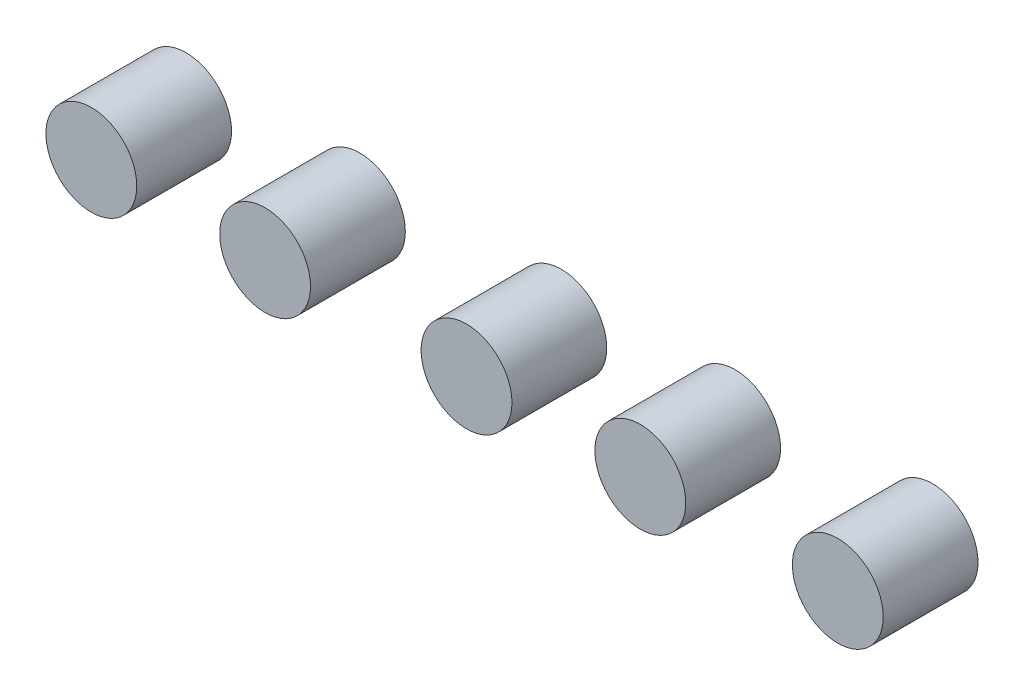
ISO-10303-21;
HEADER;
FILE_DESCRIPTION(('STEP AP214'),'2;1');
FILE_NAME('part.step','',(''),(''),'','','');
FILE_SCHEMA(('AUTOMOTIVE_DESIGN { 1 0 10303 214 1 1 1 1 }'));
ENDSEC;
DATA;
#1=APPLICATION_CONTEXT('core data for automotive mechanical design processes');
#2=APPLICATION_PROTOCOL_DEFINITION('international standard','automotive_design',2000,#1);
#3=PRODUCT_CONTEXT('',#1,'mechanical');
#4=PRODUCT('Part','Part','',(#3));
#5=PRODUCT_RELATED_PRODUCT_CATEGORY('part','',(#4));
#6=PRODUCT_DEFINITION_FORMATION('','',#4);
#7=PRODUCT_DEFINITION_CONTEXT('part definition',#1,'design');
#8=PRODUCT_DEFINITION('design','',#6,#7);
#9=PRODUCT_DEFINITION_SHAPE('','',#8);
#10=(LENGTH_UNIT() NAMED_UNIT(*) SI_UNIT(.MILLI.,.METRE.));
#11=(NAMED_UNIT(*) PLANE_ANGLE_UNIT() SI_UNIT($,.RADIAN.));
#12=(NAMED_UNIT(*) SI_UNIT($,.STERADIAN.) SOLID_ANGLE_UNIT());
#13=UNCERTAINTY_MEASURE_WITH_UNIT(LENGTH_MEASURE(1.E-05),#10,'distance_accuracy_value','');
#14=(GEOMETRIC_REPRESENTATION_CONTEXT(3) GLOBAL_UNCERTAINTY_ASSIGNED_CONTEXT((#13)) GLOBAL_UNIT_ASSIGNED_CONTEXT((#10,
#11,#12)) REPRESENTATION_CONTEXT('',''));
#15=CARTESIAN_POINT('',(0.,0.,0.));
#16=DIRECTION('',(0.,0.,1.));
#17=DIRECTION('',(1.,0.,0.));
#18=AXIS2_PLACEMENT_3D('',#15,#16,#17);
#19=CARTESIAN_POINT('',(66.4,25.5,21.4));
#20=DIRECTION('',(0.,0.,1.));
#21=DIRECTION('',(1.,0.,0.));
#22=AXIS2_PLACEMENT_3D('',#19,#20,#21);
#23=PLANE('',#22);
#24=CARTESIAN_POINT('',(66.4,25.5,21.4));
#25=DIRECTION('',(0.,0.,1.));
#26=DIRECTION('',(1.,0.,0.));
#27=AXIS2_PLACEMENT_3D('',#24,#25,#26);
#28=CIRCLE('',#27,3.1);
#29=CARTESIAN_POINT('',(69.5,25.5,21.4));
#30=VERTEX_POINT('',#29);
#31=EDGE_CURVE('P0_E10',#30,#30,#28,.T.);
#32=ORIENTED_EDGE('',*,*,#31,.F.);
#33=EDGE_LOOP('',(#32));
#34=FACE_BOUND('',#33,.T.);
#35=ADVANCED_FACE('P0_F14',(#34),#23,.F.);
#36=CARTESIAN_POINT('',(66.4,25.5,15.7));
#37=DIRECTION('',(0.,0.,1.));
#38=DIRECTION('',(1.,0.,0.));
#39=AXIS2_PLACEMENT_3D('',#36,#37,#38);
#40=CYLINDRICAL_SURFACE('',#39,3.1);
#41=ORIENTED_EDGE('',*,*,#31,.T.);
#42=EDGE_LOOP('',(#41));
#43=FACE_BOUND('',#42,.T.);
#44=CARTESIAN_POINT('',(66.4,25.5,15.8));
#45=DIRECTION('',(0.,0.,1.));
#46=DIRECTION('',(1.,0.,0.));
#47=AXIS2_PLACEMENT_3D('',#44,#45,#46);
#48=CIRCLE('',#47,3.1);
#49=CARTESIAN_POINT('',(69.5,25.5,15.8));
#50=VERTEX_POINT('',#49);
#51=EDGE_CURVE('P0_E18',#50,#50,#48,.T.);
#52=ORIENTED_EDGE('',*,*,#51,.F.);
#53=EDGE_LOOP('',(#52));
#54=FACE_BOUND('',#53,.T.);
#55=ADVANCED_FACE('P0_F16',(#43,#54),#40,.F.);
#56=CARTESIAN_POINT('',(66.4,25.5,15.8));
#57=DIRECTION('',(0.,0.,1.));
#58=DIRECTION('',(1.,0.,0.));
#59=AXIS2_PLACEMENT_3D('',#56,#57,#58);
#60=PLANE('',#59);
#61=ORIENTED_EDGE('',*,*,#51,.T.);
#62=EDGE_LOOP('',(#61));
#63=FACE_BOUND('',#62,.T.);
#64=CARTESIAN_POINT('',(66.4,25.5,15.8));
#65=DIRECTION('',(0.,0.,1.));
#66=DIRECTION('',(1.,0.,0.));
#67=AXIS2_PLACEMENT_3D('',#64,#65,#66);
#68=CIRCLE('',#67,5.75);
#69=CARTESIAN_POINT('',(72.15,25.5,15.8));
#70=VERTEX_POINT('',#69);
#71=EDGE_CURVE('P0_E32',#70,#70,#68,.T.);
#72=ORIENTED_EDGE('',*,*,#71,.F.);
#73=EDGE_LOOP('',(#72));
#74=FACE_BOUND('',#73,.T.);
#75=ADVANCED_FACE('P0_F56',(#63,#74),#60,.F.);
#76=CARTESIAN_POINT('',(66.4,25.5,27.8));
#77=DIRECTION('',(0.,0.,1.));
#78=DIRECTION('',(1.,0.,0.));
#79=AXIS2_PLACEMENT_3D('',#76,#77,#78);
#80=PLANE('',#79);
#81=CARTESIAN_POINT('',(66.4,25.5,27.8));
#82=DIRECTION('',(0.,0.,1.));
#83=DIRECTION('',(1.,0.,0.));
#84=AXIS2_PLACEMENT_3D('',#81,#82,#83);
#85=CIRCLE('',#84,5.75);
#86=CARTESIAN_POINT('',(72.15,25.5,27.8));
#87=VERTEX_POINT('',#86);
#88=EDGE_CURVE('P0_E34',#87,#87,#85,.T.);
#89=ORIENTED_EDGE('',*,*,#88,.T.);
#90=EDGE_LOOP('',(#89));
#91=FACE_BOUND('',#90,.T.);
#92=ADVANCED_FACE('P0_F47',(#91),#80,.T.);
#93=CARTESIAN_POINT('',(66.4,25.5,15.8));
#94=DIRECTION('',(0.,0.,1.));
#95=DIRECTION('',(1.,0.,0.));
#96=AXIS2_PLACEMENT_3D('',#93,#94,#95);
#97=CYLINDRICAL_SURFACE('',#96,5.75);
#98=ORIENTED_EDGE('',*,*,#88,.F.);
#99=EDGE_LOOP('',(#98));
#100=FACE_BOUND('',#99,.T.);
#101=ORIENTED_EDGE('',*,*,#71,.T.);
#102=EDGE_LOOP('',(#101));
#103=FACE_BOUND('',#102,.T.);
#104=ADVANCED_FACE('P0_F49',(#100,#103),#97,.T.);
#105=CLOSED_SHELL('',(#35,#55,#75,#92,#104));
#106=MANIFOLD_SOLID_BREP('P0_B1',#105);
#107=CARTESIAN_POINT('',(88.4,25.5,21.4));
#108=DIRECTION('',(0.,0.,1.));
#109=DIRECTION('',(1.,0.,0.));
#110=AXIS2_PLACEMENT_3D('',#107,#108,#109);
#111=PLANE('',#110);
#112=CARTESIAN_POINT('',(88.4,25.5,21.4));
#113=DIRECTION('',(0.,0.,1.));
#114=DIRECTION('',(1.,0.,0.));
#115=AXIS2_PLACEMENT_3D('',#112,#113,#114);
#116=CIRCLE('',#115,3.1);
#117=CARTESIAN_POINT('',(91.5,25.5,21.4));
#118=VERTEX_POINT('',#117);
#119=EDGE_CURVE('P1_E10',#118,#118,#116,.T.);
#120=ORIENTED_EDGE('',*,*,#119,.F.);
#121=EDGE_LOOP('',(#120));
#122=FACE_BOUND('',#121,.T.);
#123=ADVANCED_FACE('P1_F14',(#122),#111,.F.);
#124=CARTESIAN_POINT('',(88.4,25.5,15.7));
#125=DIRECTION('',(0.,0.,1.));
#126=DIRECTION('',(1.,0.,0.));
#127=AXIS2_PLACEMENT_3D('',#124,#125,#126);
#128=CYLINDRICAL_SURFACE('',#127,3.1);
#129=ORIENTED_EDGE('',*,*,#119,.T.);
#130=EDGE_LOOP('',(#129));
#131=FACE_BOUND('',#130,.T.);
#132=CARTESIAN_POINT('',(88.4,25.5,15.8));
#133=DIRECTION('',(0.,0.,1.));
#134=DIRECTION('',(1.,0.,0.));
#135=AXIS2_PLACEMENT_3D('',#132,#133,#134);
#136=CIRCLE('',#135,3.1);
#137=CARTESIAN_POINT('',(91.5,25.5,15.8));
#138=VERTEX_POINT('',#137);
#139=EDGE_CURVE('P1_E21',#138,#138,#136,.T.);
#140=ORIENTED_EDGE('',*,*,#139,.F.);
#141=EDGE_LOOP('',(#140));
#142=FACE_BOUND('',#141,.T.);
#143=ADVANCED_FACE('P1_F56',(#131,#142),#128,.F.);
#144=CARTESIAN_POINT('',(88.4,25.5,15.8));
#145=DIRECTION('',(0.,0.,1.));
#146=DIRECTION('',(1.,0.,0.));
#147=AXIS2_PLACEMENT_3D('',#144,#145,#146);
#148=PLANE('',#147);
#149=ORIENTED_EDGE('',*,*,#139,.T.);
#150=EDGE_LOOP('',(#149));
#151=FACE_BOUND('',#150,.T.);
#152=CARTESIAN_POINT('',(88.4,25.5,15.8));
#153=DIRECTION('',(0.,0.,1.));
#154=DIRECTION('',(1.,0.,0.));
#155=AXIS2_PLACEMENT_3D('',#152,#153,#154);
#156=CIRCLE('',#155,5.75);
#157=CARTESIAN_POINT('',(94.15,25.5,15.8));
#158=VERTEX_POINT('',#157);
#159=EDGE_CURVE('P1_E30',#158,#158,#156,.T.);
#160=ORIENTED_EDGE('',*,*,#159,.F.);
#161=EDGE_LOOP('',(#160));
#162=FACE_BOUND('',#161,.T.);
#163=ADVANCED_FACE('P1_F54',(#151,#162),#148,.F.);
#164=CARTESIAN_POINT('',(88.4,25.5,27.8));
#165=DIRECTION('',(0.,0.,1.));
#166=DIRECTION('',(1.,0.,0.));
#167=AXIS2_PLACEMENT_3D('',#164,#165,#166);
#168=PLANE('',#167);
#169=CARTESIAN_POINT('',(88.4,25.5,27.8));
#170=DIRECTION('',(0.,0.,1.));
#171=DIRECTION('',(1.,0.,0.));
#172=AXIS2_PLACEMENT_3D('',#169,#170,#171);
#173=CIRCLE('',#172,5.75);
#174=CARTESIAN_POINT('',(94.15,25.5,27.8));
#175=VERTEX_POINT('',#174);
#176=EDGE_CURVE('P1_E37',#175,#175,#173,.T.);
#177=ORIENTED_EDGE('',*,*,#176,.T.);
#178=EDGE_LOOP('',(#177));
#179=FACE_BOUND('',#178,.T.);
#180=ADVANCED_FACE('P1_F46',(#179),#168,.T.);
#181=CARTESIAN_POINT('',(88.4,25.5,15.8));
#182=DIRECTION('',(0.,0.,1.));
#183=DIRECTION('',(1.,0.,0.));
#184=AXIS2_PLACEMENT_3D('',#181,#182,#183);
#185=CYLINDRICAL_SURFACE('',#184,5.75);
#186=ORIENTED_EDGE('',*,*,#176,.F.);
#187=EDGE_LOOP('',(#186));
#188=FACE_BOUND('',#187,.T.);
#189=ORIENTED_EDGE('',*,*,#159,.T.);
#190=EDGE_LOOP('',(#189));
#191=FACE_BOUND('',#190,.T.);
#192=ADVANCED_FACE('P1_F48',(#188,#191),#185,.T.);
#193=CLOSED_SHELL('',(#123,#143,#163,#180,#192));
#194=MANIFOLD_SOLID_BREP('P1_B1',#193);
#195=CARTESIAN_POINT('',(113.9,25.5,21.4));
#196=DIRECTION('',(0.,0.,1.));
#197=DIRECTION('',(1.,0.,0.));
#198=AXIS2_PLACEMENT_3D('',#195,#196,#197);
#199=PLANE('',#198);
#200=CARTESIAN_POINT('',(113.9,25.5,21.4));
#201=DIRECTION('',(0.,0.,1.));
#202=DIRECTION('',(1.,0.,0.));
#203=AXIS2_PLACEMENT_3D('',#200,#201,#202);
#204=CIRCLE('',#203,3.1);
#205=CARTESIAN_POINT('',(117.,25.5,21.4));
#206=VERTEX_POINT('',#205);
#207=EDGE_CURVE('P2_E10',#206,#206,#204,.T.);
#208=ORIENTED_EDGE('',*,*,#207,.F.);
#209=EDGE_LOOP('',(#208));
#210=FACE_BOUND('',#209,.T.);
#211=ADVANCED_FACE('P2_F14',(#210),#199,.F.);
#212=CARTESIAN_POINT('',(113.9,25.5,15.7));
#213=DIRECTION('',(0.,0.,1.));
#214=DIRECTION('',(1.,0.,0.));
#215=AXIS2_PLACEMENT_3D('',#212,#213,#214);
#216=CYLINDRICAL_SURFACE('',#215,3.1);
#217=ORIENTED_EDGE('',*,*,#207,.T.);
#218=EDGE_LOOP('',(#217));
#219=FACE_BOUND('',#218,.T.);
#220=CARTESIAN_POINT('',(113.9,25.5,15.8));
#221=DIRECTION('',(0.,0.,1.));
#222=DIRECTION('',(1.,0.,0.));
#223=AXIS2_PLACEMENT_3D('',#220,#221,#222);
#224=CIRCLE('',#223,3.1);
#225=CARTESIAN_POINT('',(117.,25.5,15.8));
#226=VERTEX_POINT('',#225);
#227=EDGE_CURVE('P2_E21',#226,#226,#224,.T.);
#228=ORIENTED_EDGE('',*,*,#227,.F.);
#229=EDGE_LOOP('',(#228));
#230=FACE_BOUND('',#229,.T.);
#231=ADVANCED_FACE('P2_F56',(#219,#230),#216,.F.);
#232=CARTESIAN_POINT('',(113.9,25.5,15.8));
#233=DIRECTION('',(0.,0.,1.));
#234=DIRECTION('',(1.,0.,0.));
#235=AXIS2_PLACEMENT_3D('',#232,#233,#234);
#236=PLANE('',#235);
#237=ORIENTED_EDGE('',*,*,#227,.T.);
#238=EDGE_LOOP('',(#237));
#239=FACE_BOUND('',#238,.T.);
#240=CARTESIAN_POINT('',(113.9,25.5,15.8));
#241=DIRECTION('',(0.,0.,1.));
#242=DIRECTION('',(1.,0.,0.));
#243=AXIS2_PLACEMENT_3D('',#240,#241,#242);
#244=CIRCLE('',#243,5.75);
#245=CARTESIAN_POINT('',(119.65,25.5,15.8));
#246=VERTEX_POINT('',#245);
#247=EDGE_CURVE('P2_E30',#246,#246,#244,.T.);
#248=ORIENTED_EDGE('',*,*,#247,.F.);
#249=EDGE_LOOP('',(#248));
#250=FACE_BOUND('',#249,.T.);
#251=ADVANCED_FACE('P2_F54',(#239,#250),#236,.F.);
#252=CARTESIAN_POINT('',(113.9,25.5,27.8));
#253=DIRECTION('',(0.,0.,1.));
#254=DIRECTION('',(1.,0.,0.));
#255=AXIS2_PLACEMENT_3D('',#252,#253,#254);
#256=PLANE('',#255);
#257=CARTESIAN_POINT('',(113.9,25.5,27.8));
#258=DIRECTION('',(0.,0.,1.));
#259=DIRECTION('',(1.,0.,0.));
#260=AXIS2_PLACEMENT_3D('',#257,#258,#259);
#261=CIRCLE('',#260,5.75);
#262=CARTESIAN_POINT('',(119.65,25.5,27.8));
#263=VERTEX_POINT('',#262);
#264=EDGE_CURVE('P2_E37',#263,#263,#261,.T.);
#265=ORIENTED_EDGE('',*,*,#264,.T.);
#266=EDGE_LOOP('',(#265));
#267=FACE_BOUND('',#266,.T.);
#268=ADVANCED_FACE('P2_F46',(#267),#256,.T.);
#269=CARTESIAN_POINT('',(113.9,25.5,15.8));
#270=DIRECTION('',(0.,0.,1.));
#271=DIRECTION('',(1.,0.,0.));
#272=AXIS2_PLACEMENT_3D('',#269,#270,#271);
#273=CYLINDRICAL_SURFACE('',#272,5.75);
#274=ORIENTED_EDGE('',*,*,#264,.F.);
#275=EDGE_LOOP('',(#274));
#276=FACE_BOUND('',#275,.T.);
#277=ORIENTED_EDGE('',*,*,#247,.T.);
#278=EDGE_LOOP('',(#277));
#279=FACE_BOUND('',#278,.T.);
#280=ADVANCED_FACE('P2_F48',(#276,#279),#273,.T.);
#281=CLOSED_SHELL('',(#211,#231,#251,#268,#280));
#282=MANIFOLD_SOLID_BREP('P2_B1',#281);
#283=CARTESIAN_POINT('',(135.9,25.5,21.4));
#284=DIRECTION('',(0.,0.,1.));
#285=DIRECTION('',(1.,0.,0.));
#286=AXIS2_PLACEMENT_3D('',#283,#284,#285);
#287=PLANE('',#286);
#288=CARTESIAN_POINT('',(135.9,25.5,21.4));
#289=DIRECTION('',(0.,0.,1.));
#290=DIRECTION('',(1.,0.,0.));
#291=AXIS2_PLACEMENT_3D('',#288,#289,#290);
#292=CIRCLE('',#291,3.1);
#293=CARTESIAN_POINT('',(139.,25.5,21.4));
#294=VERTEX_POINT('',#293);
#295=EDGE_CURVE('P3_E10',#294,#294,#292,.T.);
#296=ORIENTED_EDGE('',*,*,#295,.F.);
#297=EDGE_LOOP('',(#296));
#298=FACE_BOUND('',#297,.T.);
#299=ADVANCED_FACE('P3_F14',(#298),#287,.F.);
#300=CARTESIAN_POINT('',(135.9,25.5,15.7));
#301=DIRECTION('',(0.,0.,1.));
#302=DIRECTION('',(1.,0.,0.));
#303=AXIS2_PLACEMENT_3D('',#300,#301,#302);
#304=CYLINDRICAL_SURFACE('',#303,3.1);
#305=ORIENTED_EDGE('',*,*,#295,.T.);
#306=EDGE_LOOP('',(#305));
#307=FACE_BOUND('',#306,.T.);
#308=CARTESIAN_POINT('',(135.9,25.5,15.8));
#309=DIRECTION('',(0.,0.,1.));
#310=DIRECTION('',(1.,0.,0.));
#311=AXIS2_PLACEMENT_3D('',#308,#309,#310);
#312=CIRCLE('',#311,3.1);
#313=CARTESIAN_POINT('',(139.,25.5,15.8));
#314=VERTEX_POINT('',#313);
#315=EDGE_CURVE('P3_E21',#314,#314,#312,.T.);
#316=ORIENTED_EDGE('',*,*,#315,.F.);
#317=EDGE_LOOP('',(#316));
#318=FACE_BOUND('',#317,.T.);
#319=ADVANCED_FACE('P3_F56',(#307,#318),#304,.F.);
#320=CARTESIAN_POINT('',(135.9,25.5,15.8));
#321=DIRECTION('',(0.,0.,1.));
#322=DIRECTION('',(1.,0.,0.));
#323=AXIS2_PLACEMENT_3D('',#320,#321,#322);
#324=PLANE('',#323);
#325=ORIENTED_EDGE('',*,*,#315,.T.);
#326=EDGE_LOOP('',(#325));
#327=FACE_BOUND('',#326,.T.);
#328=CARTESIAN_POINT('',(135.9,25.5,15.8));
#329=DIRECTION('',(0.,0.,1.));
#330=DIRECTION('',(1.,0.,0.));
#331=AXIS2_PLACEMENT_3D('',#328,#329,#330);
#332=CIRCLE('',#331,5.75);
#333=CARTESIAN_POINT('',(141.65,25.5,15.8));
#334=VERTEX_POINT('',#333);
#335=EDGE_CURVE('P3_E30',#334,#334,#332,.T.);
#336=ORIENTED_EDGE('',*,*,#335,.F.);
#337=EDGE_LOOP('',(#336));
#338=FACE_BOUND('',#337,.T.);
#339=ADVANCED_FACE('P3_F54',(#327,#338),#324,.F.);
#340=CARTESIAN_POINT('',(135.9,25.5,27.8));
#341=DIRECTION('',(0.,0.,1.));
#342=DIRECTION('',(1.,0.,0.));
#343=AXIS2_PLACEMENT_3D('',#340,#341,#342);
#344=PLANE('',#343);
#345=CARTESIAN_POINT('',(135.9,25.5,27.8));
#346=DIRECTION('',(0.,0.,1.));
#347=DIRECTION('',(1.,0.,0.));
#348=AXIS2_PLACEMENT_3D('',#345,#346,#347);
#349=CIRCLE('',#348,5.75);
#350=CARTESIAN_POINT('',(141.65,25.5,27.8));
#351=VERTEX_POINT('',#350);
#352=EDGE_CURVE('P3_E37',#351,#351,#349,.T.);
#353=ORIENTED_EDGE('',*,*,#352,.T.);
#354=EDGE_LOOP('',(#353));
#355=FACE_BOUND('',#354,.T.);
#356=ADVANCED_FACE('P3_F46',(#355),#344,.T.);
#357=CARTESIAN_POINT('',(135.9,25.5,15.8));
#358=DIRECTION('',(0.,0.,1.));
#359=DIRECTION('',(1.,0.,0.));
#360=AXIS2_PLACEMENT_3D('',#357,#358,#359);
#361=CYLINDRICAL_SURFACE('',#360,5.75);
#362=ORIENTED_EDGE('',*,*,#352,.F.);
#363=EDGE_LOOP('',(#362));
#364=FACE_BOUND('',#363,.T.);
#365=ORIENTED_EDGE('',*,*,#335,.T.);
#366=EDGE_LOOP('',(#365));
#367=FACE_BOUND('',#366,.T.);
#368=ADVANCED_FACE('P3_F48',(#364,#367),#361,.T.);
#369=CLOSED_SHELL('',(#299,#319,#339,#356,#368));
#370=MANIFOLD_SOLID_BREP('P3_B1',#369);
#371=CARTESIAN_POINT('',(160.9,25.5,21.4));
#372=DIRECTION('',(0.,0.,1.));
#373=DIRECTION('',(1.,0.,0.));
#374=AXIS2_PLACEMENT_3D('',#371,#372,#373);
#375=PLANE('',#374);
#376=CARTESIAN_POINT('',(160.9,25.5,21.4));
#377=DIRECTION('',(0.,0.,1.));
#378=DIRECTION('',(1.,0.,0.));
#379=AXIS2_PLACEMENT_3D('',#376,#377,#378);
#380=CIRCLE('',#379,3.1);
#381=CARTESIAN_POINT('',(164.,25.5,21.4));
#382=VERTEX_POINT('',#381);
#383=EDGE_CURVE('P4_E9',#382,#382,#380,.T.);
#384=ORIENTED_EDGE('',*,*,#383,.F.);
#385=EDGE_LOOP('',(#384));
#386=FACE_BOUND('',#385,.T.);
#387=ADVANCED_FACE('P4_F13',(#386),#375,.F.);
#388=CARTESIAN_POINT('',(160.9,25.5,15.7));
#389=DIRECTION('',(0.,0.,1.));
#390=DIRECTION('',(1.,0.,0.));
#391=AXIS2_PLACEMENT_3D('',#388,#389,#390);
#392=CYLINDRICAL_SURFACE('',#391,3.1);
#393=ORIENTED_EDGE('',*,*,#383,.T.);
#394=EDGE_LOOP('',(#393));
#395=FACE_BOUND('',#394,.T.);
#396=CARTESIAN_POINT('',(160.9,25.5,15.8));
#397=DIRECTION('',(0.,0.,1.));
#398=DIRECTION('',(1.,0.,0.));
#399=AXIS2_PLACEMENT_3D('',#396,#397,#398);
#400=CIRCLE('',#399,3.1);
#401=CARTESIAN_POINT('',(164.,25.5,15.8));
#402=VERTEX_POINT('',#401);
#403=EDGE_CURVE('P4_E16',#402,#402,#400,.T.);
#404=ORIENTED_EDGE('',*,*,#403,.F.);
#405=EDGE_LOOP('',(#404));
#406=FACE_BOUND('',#405,.T.);
#407=ADVANCED_FACE('P4_F46',(#395,#406),#392,.F.);
#408=CARTESIAN_POINT('',(160.9,25.5,15.8));
#409=DIRECTION('',(0.,0.,1.));
#410=DIRECTION('',(1.,0.,0.));
#411=AXIS2_PLACEMENT_3D('',#408,#409,#410);
#412=PLANE('',#411);
#413=ORIENTED_EDGE('',*,*,#403,.T.);
#414=EDGE_LOOP('',(#413));
#415=FACE_BOUND('',#414,.T.);
#416=CARTESIAN_POINT('',(160.9,25.5,15.8));
#417=DIRECTION('',(0.,0.,1.));
#418=DIRECTION('',(1.,0.,0.));
#419=AXIS2_PLACEMENT_3D('',#416,#417,#418);
#420=CIRCLE('',#419,5.75);
#421=CARTESIAN_POINT('',(166.65,25.5,15.8));
#422=VERTEX_POINT('',#421);
#423=EDGE_CURVE('P4_E30',#422,#422,#420,.T.);
#424=ORIENTED_EDGE('',*,*,#423,.F.);
#425=EDGE_LOOP('',(#424));
#426=FACE_BOUND('',#425,.T.);
#427=ADVANCED_FACE('P4_F43',(#415,#426),#412,.F.);
#428=CARTESIAN_POINT('',(160.9,25.5,27.8));
#429=DIRECTION('',(0.,0.,1.));
#430=DIRECTION('',(1.,0.,0.));
#431=AXIS2_PLACEMENT_3D('',#428,#429,#430);
#432=PLANE('',#431);
#433=CARTESIAN_POINT('',(160.9,25.5,27.8));
#434=DIRECTION('',(0.,0.,1.));
#435=DIRECTION('',(1.,0.,0.));
#436=AXIS2_PLACEMENT_3D('',#433,#434,#435);
#437=CIRCLE('',#436,5.75);
#438=CARTESIAN_POINT('',(166.65,25.5,27.8));
#439=VERTEX_POINT('',#438);
#440=EDGE_CURVE('P4_E32',#439,#439,#437,.T.);
#441=ORIENTED_EDGE('',*,*,#440,.T.);
#442=EDGE_LOOP('',(#441));
#443=FACE_BOUND('',#442,.T.);
#444=ADVANCED_FACE('P4_F45',(#443),#432,.T.);
#445=CARTESIAN_POINT('',(160.9,25.5,15.8));
#446=DIRECTION('',(0.,0.,1.));
#447=DIRECTION('',(1.,0.,0.));
#448=AXIS2_PLACEMENT_3D('',#445,#446,#447);
#449=CYLINDRICAL_SURFACE('',#448,5.75);
#450=ORIENTED_EDGE('',*,*,#440,.F.);
#451=EDGE_LOOP('',(#450));
#452=FACE_BOUND('',#451,.T.);
#453=ORIENTED_EDGE('',*,*,#423,.T.);
#454=EDGE_LOOP('',(#453));
#455=FACE_BOUND('',#454,.T.);
#456=ADVANCED_FACE('P4_F41',(#452,#455),#449,.T.);
#457=CLOSED_SHELL('',(#387,#407,#427,#444,#456));
#458=MANIFOLD_SOLID_BREP('P4_B1',#457);
#459=ADVANCED_BREP_SHAPE_REPRESENTATION('',(#18,#106,#194,#282,#370,#458),#14);
#460=SHAPE_DEFINITION_REPRESENTATION(#9,#459);
ENDSEC;
END-ISO-10303-21;
